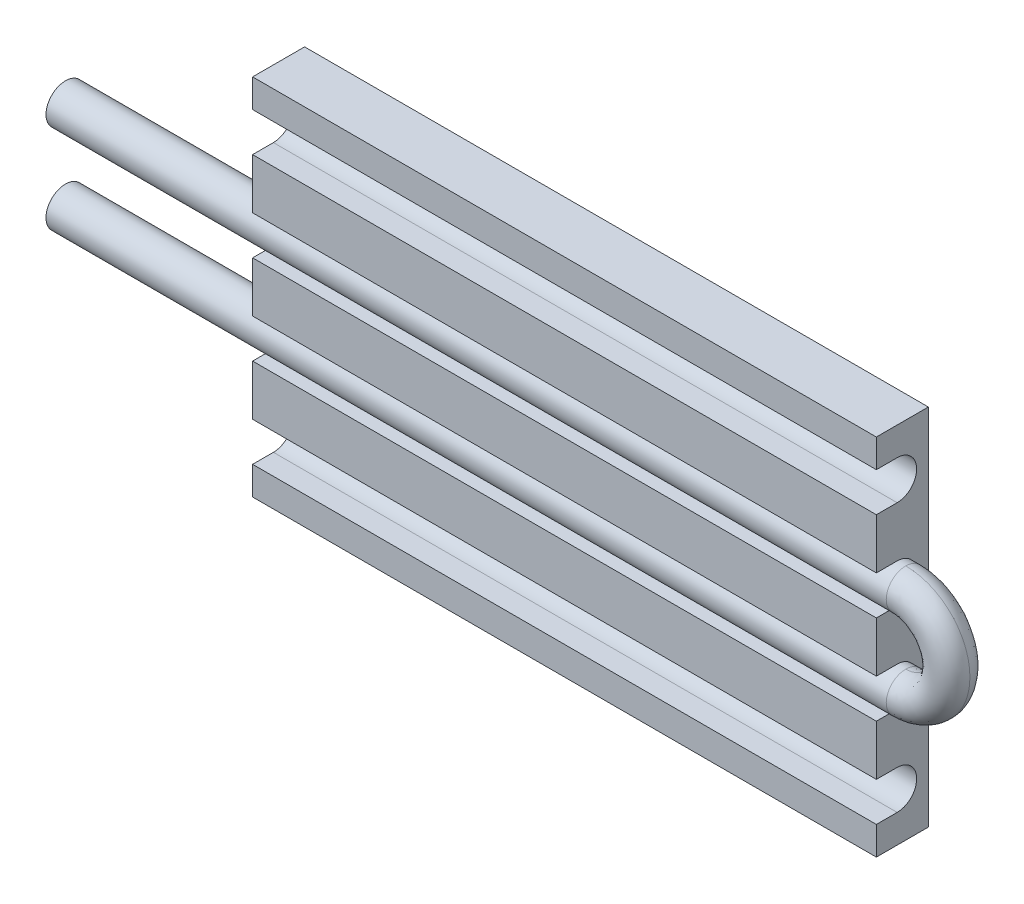
ISO-10303-21;
HEADER;
FILE_DESCRIPTION(('STEP AP214'),'2;1');
FILE_NAME('part.step','',(''),(''),'','','');
FILE_SCHEMA(('AUTOMOTIVE_DESIGN { 1 0 10303 214 1 1 1 1 }'));
ENDSEC;
DATA;
#1=APPLICATION_CONTEXT('core data for automotive mechanical design processes');
#2=APPLICATION_PROTOCOL_DEFINITION('international standard','automotive_design',2000,#1);
#3=PRODUCT_CONTEXT('',#1,'mechanical');
#4=PRODUCT('Part','Part','',(#3));
#5=PRODUCT_RELATED_PRODUCT_CATEGORY('part','',(#4));
#6=PRODUCT_DEFINITION_FORMATION('','',#4);
#7=PRODUCT_DEFINITION_CONTEXT('part definition',#1,'design');
#8=PRODUCT_DEFINITION('design','',#6,#7);
#9=PRODUCT_DEFINITION_SHAPE('','',#8);
#10=(LENGTH_UNIT() NAMED_UNIT(*) SI_UNIT(.MILLI.,.METRE.));
#11=(NAMED_UNIT(*) PLANE_ANGLE_UNIT() SI_UNIT($,.RADIAN.));
#12=(NAMED_UNIT(*) SI_UNIT($,.STERADIAN.) SOLID_ANGLE_UNIT());
#13=UNCERTAINTY_MEASURE_WITH_UNIT(LENGTH_MEASURE(1.E-05),#10,'distance_accuracy_value','');
#14=(GEOMETRIC_REPRESENTATION_CONTEXT(3) GLOBAL_UNCERTAINTY_ASSIGNED_CONTEXT((#13)) GLOBAL_UNIT_ASSIGNED_CONTEXT((#10,
#11,#12)) REPRESENTATION_CONTEXT('',''));
#15=CARTESIAN_POINT('',(0.,0.,0.));
#16=DIRECTION('',(0.,0.,1.));
#17=DIRECTION('',(1.,0.,0.));
#18=AXIS2_PLACEMENT_3D('',#15,#16,#17);
#19=CARTESIAN_POINT('',(94.8054999994022,-7.45329266260001,17.3045433430025));
#20=CARTESIAN_POINT('',(107.172085324602,-7.45329266260001,17.3045433430025));
#21=CARTESIAN_POINT('',(107.172085324602,4.91329266259999,17.3045433430025));
#22=CARTESIAN_POINT('',(94.8054999994022,4.91329266259999,17.3045433430025));
#23=CARTESIAN_POINT('',(94.8054999994021,-7.15216816960002,20.3057440716025));
#24=CARTESIAN_POINT('',(106.569836338602,-7.15216816960002,20.3057440716025));
#25=CARTESIAN_POINT('',(106.569836338602,4.61216816959998,20.3057440716025));
#26=CARTESIAN_POINT('',(94.8054999994021,4.61216816959998,20.3057440716025));
#27=CARTESIAN_POINT('',(94.8054999994021,-9.17573051820003,22.5424999994025));
#28=CARTESIAN_POINT('',(110.616961010402,-9.17573051820003,22.5424999994025));
#29=CARTESIAN_POINT('',(110.616961010402,6.63573051819998,22.5424999994026));
#30=CARTESIAN_POINT('',(94.8054999994021,6.63573051819998,22.5424999994025));
#31=CARTESIAN_POINT('',(94.8054999994021,-12.192,22.5424999994024));
#32=CARTESIAN_POINT('',(116.649499999402,-12.192,22.5424999994025));
#33=CARTESIAN_POINT('',(116.649499999402,9.65199999999998,22.5424999994026));
#34=CARTESIAN_POINT('',(94.8054999994021,9.65199999999998,22.5424999994025));
#35=CARTESIAN_POINT('',(94.8054999994021,-15.2082694818,22.5424999994024));
#36=CARTESIAN_POINT('',(122.682038988402,-15.2082694818,22.5424999994025));
#37=CARTESIAN_POINT('',(122.682038988402,12.6682694818,22.5424999994026));
#38=CARTESIAN_POINT('',(94.8054999994021,12.6682694818,22.5424999994025));
#39=CARTESIAN_POINT('',(94.8054999994021,-17.2318318304,20.3057440716024));
#40=CARTESIAN_POINT('',(126.729163660202,-17.2318318304,20.3057440716025));
#41=CARTESIAN_POINT('',(126.729163660202,14.6918318304,20.3057440716027));
#42=CARTESIAN_POINT('',(94.8054999994021,14.6918318304,20.3057440716025));
#43=CARTESIAN_POINT('',(94.8054999994022,-16.9307073374,17.3045433430024));
#44=CARTESIAN_POINT('',(126.126914674202,-16.9307073374,17.3045433430025));
#45=CARTESIAN_POINT('',(126.126914674202,14.3907073374,17.3045433430026));
#46=CARTESIAN_POINT('',(94.8054999994022,14.3907073374,17.3045433430025));
#47=(BOUNDED_SURFACE() B_SPLINE_SURFACE(3,3,((#19,#20,#21,#22),(#23,#24,#25,#26),(#27,#28,#29,
#30),(#31,#32,#33,#34),(#35,#36,#37,#38),(#39,#40,#41,#42),(#43,#44,#45,#46)),.UNSPECIFIED.,.F.,
.F.,.F.) B_SPLINE_SURFACE_WITH_KNOTS((4,3,4),(4,4),(0.,0.5,1.),(0.,1.),
.UNSPECIFIED.) GEOMETRIC_REPRESENTATION_ITEM() RATIONAL_B_SPLINE_SURFACE(((1.,0.333333333333333,
0.333333333333333,1.),(0.780588314885163,0.260196104961721,0.260196104961721,0.780588314885163),
(0.780588314885163,0.260196104961721,0.260196104961721,0.780588314885163),(1.,0.333333333333333,
0.333333333333333,1.),(0.780588314885163,0.260196104961721,0.260196104961721,0.780588314885163),
(0.780588314885163,0.260196104961721,0.260196104961721,0.780588314885163),(1.,0.333333333333333,
0.333333333333333,1.))) REPRESENTATION_ITEM('') SURFACE());
#48=CARTESIAN_POINT('',(94.8054999994022,-12.192,17.7799999994024));
#49=DIRECTION('',(-1.,0.,0.));
#50=DIRECTION('',(0.,-1.,0.));
#51=AXIS2_PLACEMENT_3D('',#48,#49,#50);
#52=CIRCLE('',#51,4.7625);
#53=CARTESIAN_POINT('',(94.8054999994022,-16.9545000003665,17.7799999986294));
#54=VERTEX_POINT('',#53);
#55=CARTESIAN_POINT('',(94.8054999994022,-7.42949999981678,17.7799999976526));
#56=VERTEX_POINT('',#55);
#57=EDGE_CURVE('E201',#54,#56,#52,.T.);
#58=CARTESIAN_POINT('',(94.8054999994022,-1.27000000000001,17.7799999978564));
#59=DIRECTION('',(0.,0.,-1.));
#60=DIRECTION('',(1.,0.,0.));
#61=AXIS2_PLACEMENT_3D('',#58,#59,#60);
#62=CIRCLE('',#61,15.6845000007329);
#63=CARTESIAN_POINT('',(94.8054999994022,14.4145000001832,17.7799999976527));
#64=VERTEX_POINT('',#63);
#65=EDGE_CURVE('E191',#64,#54,#62,.T.);
#66=CARTESIAN_POINT('',(94.8054999994021,9.65199999999999,17.7799999994025));
#67=DIRECTION('',(-1.,0.,0.));
#68=DIRECTION('',(0.,-1.,0.));
#69=AXIS2_PLACEMENT_3D('',#66,#67,#68);
#70=CIRCLE('',#69,4.7625);
#71=CARTESIAN_POINT('',(94.8054999994022,4.88949999963353,17.7799999986294));
#72=VERTEX_POINT('',#71);
#73=EDGE_CURVE('E209',#72,#64,#70,.T.);
#74=CARTESIAN_POINT('',(94.8054999994021,-1.27000000000001,17.7799999978564));
#75=DIRECTION('',(0.,0.,1.));
#76=DIRECTION('',(-1.,0.,0.));
#77=AXIS2_PLACEMENT_3D('',#74,#75,#76);
#78=CIRCLE('',#77,6.15949999926707);
#79=EDGE_CURVE('E202',#56,#72,#78,.T.);
#80=ORIENTED_EDGE('',*,*,#57,.F.);
#81=ORIENTED_EDGE('',*,*,#65,.F.);
#82=ORIENTED_EDGE('',*,*,#73,.F.);
#83=ORIENTED_EDGE('',*,*,#79,.F.);
#84=EDGE_LOOP('',(#80,#81,#82,#83));
#85=FACE_BOUND('',#84,.T.);
#86=ADVANCED_FACE('F42',(#85),#47,.T.);
#87=CARTESIAN_POINT('',(94.8054999994022,-16.9307073374,18.2554566558024));
#88=CARTESIAN_POINT('',(126.126914674202,-16.9307073374,18.2554566558025));
#89=CARTESIAN_POINT('',(126.126914674202,14.3907073374,18.2554566558026));
#90=CARTESIAN_POINT('',(94.8054999994022,14.3907073374,18.2554566558025));
#91=CARTESIAN_POINT('',(94.8054999994022,-17.2318318304,15.2542559272024));
#92=CARTESIAN_POINT('',(126.729163660202,-17.2318318304,15.2542559272025));
#93=CARTESIAN_POINT('',(126.729163660202,14.6918318304,15.2542559272027));
#94=CARTESIAN_POINT('',(94.8054999994022,14.6918318304,15.2542559272025));
#95=CARTESIAN_POINT('',(94.8054999994022,-15.2082694818,13.0174999994024));
#96=CARTESIAN_POINT('',(122.682038988402,-15.2082694818,13.0174999994025));
#97=CARTESIAN_POINT('',(122.682038988402,12.6682694818,13.0174999994026));
#98=CARTESIAN_POINT('',(94.8054999994022,12.6682694818,13.0174999994025));
#99=CARTESIAN_POINT('',(94.8054999994022,-12.192,13.0174999994024));
#100=CARTESIAN_POINT('',(116.649499999402,-12.192,13.0174999994025));
#101=CARTESIAN_POINT('',(116.649499999402,9.65200000000001,13.0174999994026));
#102=CARTESIAN_POINT('',(94.8054999994022,9.65200000000001,13.0174999994025));
#103=CARTESIAN_POINT('',(94.8054999994022,-9.17573051819999,13.0174999994025));
#104=CARTESIAN_POINT('',(110.616961010402,-9.17573051819999,13.0174999994025));
#105=CARTESIAN_POINT('',(110.616961010402,6.63573051820001,13.0174999994026));
#106=CARTESIAN_POINT('',(94.8054999994022,6.63573051820001,13.0174999994025));
#107=CARTESIAN_POINT('',(94.8054999994022,-7.1521681696,15.2542559272025));
#108=CARTESIAN_POINT('',(106.569836338602,-7.1521681696,15.2542559272025));
#109=CARTESIAN_POINT('',(106.569836338602,4.6121681696,15.2542559272025));
#110=CARTESIAN_POINT('',(94.8054999994022,4.6121681696,15.2542559272025));
#111=CARTESIAN_POINT('',(94.8054999994022,-7.45329266260001,18.2554566558025));
#112=CARTESIAN_POINT('',(107.172085324602,-7.45329266260001,18.2554566558025));
#113=CARTESIAN_POINT('',(107.172085324602,4.91329266259999,18.2554566558025));
#114=CARTESIAN_POINT('',(94.8054999994022,4.91329266259999,18.2554566558025));
#115=(BOUNDED_SURFACE() B_SPLINE_SURFACE(3,3,((#87,#88,#89,#90),(#91,#92,#93,#94),(#95,#96,#97,
#98),(#99,#100,#101,#102),(#103,#104,#105,#106),(#107,#108,#109,#110),(#111,#112,#113,#114)),
.UNSPECIFIED.,.F.,.F.,.F.) B_SPLINE_SURFACE_WITH_KNOTS((4,3,4),(4,4),(0.,0.5,1.),(0.,1.),
.UNSPECIFIED.) GEOMETRIC_REPRESENTATION_ITEM() RATIONAL_B_SPLINE_SURFACE(((1.,0.333333333333333,
0.333333333333333,1.),(0.780588314885163,0.260196104961721,0.260196104961721,0.780588314885163),
(0.780588314885163,0.260196104961721,0.260196104961721,0.780588314885163),(1.,0.333333333333333,
0.333333333333333,1.),(0.780588314885163,0.260196104961721,0.260196104961721,0.780588314885163),
(0.780588314885163,0.260196104961721,0.260196104961721,0.780588314885163),(1.,0.333333333333333,
0.333333333333333,1.))) REPRESENTATION_ITEM('') SURFACE());
#116=CARTESIAN_POINT('',(94.8054999994022,-12.192,17.7799999994024));
#117=DIRECTION('',(-1.,0.,0.));
#118=DIRECTION('',(0.,-1.,0.));
#119=AXIS2_PLACEMENT_3D('',#116,#117,#118);
#120=CIRCLE('',#119,4.7625);
#121=EDGE_CURVE('E194',#56,#54,#120,.T.);
#122=CARTESIAN_POINT('',(94.8054999994022,9.65199999999999,17.7799999994025));
#123=DIRECTION('',(-1.,0.,0.));
#124=DIRECTION('',(0.,-1.,0.));
#125=AXIS2_PLACEMENT_3D('',#122,#123,#124);
#126=CIRCLE('',#125,4.7625);
#127=EDGE_CURVE('E196',#64,#72,#126,.T.);
#128=ORIENTED_EDGE('',*,*,#65,.T.);
#129=ORIENTED_EDGE('',*,*,#121,.F.);
#130=ORIENTED_EDGE('',*,*,#79,.T.);
#131=ORIENTED_EDGE('',*,*,#127,.F.);
#132=EDGE_LOOP('',(#128,#129,#130,#131));
#133=FACE_BOUND('',#132,.T.);
#134=ADVANCED_FACE('F193',(#133),#115,.T.);
#135=CARTESIAN_POINT('',(-110.490000000598,-7.37234999999999,12.9603499994017));
#136=DIRECTION('',(-1.,0.,0.));
#137=DIRECTION('',(0.,-1.,0.));
#138=AXIS2_PLACEMENT_3D('',#135,#136,#137);
#139=PLANE('',#138);
#140=CARTESIAN_POINT('',(-110.490000000598,-12.192,17.7799999994017));
#141=DIRECTION('',(-1.,0.,0.));
#142=DIRECTION('',(0.,-1.,0.));
#143=AXIS2_PLACEMENT_3D('',#140,#141,#142);
#144=CIRCLE('',#143,4.7625);
#145=CARTESIAN_POINT('',(-110.490000000598,-16.9545,17.7799999994017));
#146=VERTEX_POINT('',#145);
#147=EDGE_CURVE('E47',#146,#146,#144,.F.);
#148=ORIENTED_EDGE('',*,*,#147,.F.);
#149=EDGE_LOOP('',(#148));
#150=FACE_BOUND('',#149,.T.);
#151=ADVANCED_FACE('F683',(#150),#139,.T.);
#152=CARTESIAN_POINT('',(-110.490000000598,4.83235000000001,12.9603499994018));
#153=DIRECTION('',(1.,0.,0.));
#154=DIRECTION('',(0.,1.,0.));
#155=AXIS2_PLACEMENT_3D('',#152,#153,#154);
#156=PLANE('',#155);
#157=CARTESIAN_POINT('',(-110.490000000598,9.65199999999999,17.7799999994018));
#158=DIRECTION('',(-1.,0.,0.));
#159=DIRECTION('',(0.,-1.,0.));
#160=AXIS2_PLACEMENT_3D('',#157,#158,#159);
#161=CIRCLE('',#160,4.7625);
#162=CARTESIAN_POINT('',(-110.490000000598,4.88949999999999,17.7799999994018));
#163=VERTEX_POINT('',#162);
#164=EDGE_CURVE('E263',#163,#163,#161,.F.);
#165=ORIENTED_EDGE('',*,*,#164,.F.);
#166=EDGE_LOOP('',(#165));
#167=FACE_BOUND('',#166,.T.);
#168=ADVANCED_FACE('F525',(#167),#156,.F.);
#169=CARTESIAN_POINT('',(-59.6900000005979,26.7335,17.779999999402));
#170=DIRECTION('',(0.,-1.,0.));
#171=DIRECTION('',(1.,0.,0.));
#172=AXIS2_PLACEMENT_3D('',#169,#170,#171);
#173=PLANE('',#172);
#174=DIRECTION('',(1.,0.,0.));
#175=VECTOR('',#174,1.);
#176=CARTESIAN_POINT('',(-59.6900000005979,26.7335,22.859999999402));
#177=LINE('',#176,#175);
#178=CARTESIAN_POINT('',(-59.6900000005979,26.7335,22.859999999402));
#179=VERTEX_POINT('',#178);
#180=CARTESIAN_POINT('',(92.7099999994021,26.7335,22.8599999994026));
#181=VERTEX_POINT('',#180);
#182=EDGE_CURVE('E273',#179,#181,#177,.T.);
#183=ORIENTED_EDGE('',*,*,#182,.T.);
#184=DIRECTION('',(0.,0.,1.));
#185=VECTOR('',#184,1.);
#186=CARTESIAN_POINT('',(92.7099999994022,26.7335,10.1599999994026));
#187=LINE('',#186,#185);
#188=CARTESIAN_POINT('',(92.7099999994022,26.7335,17.7799999991584));
#189=VERTEX_POINT('',#188);
#190=EDGE_CURVE('E245',#181,#189,#187,.F.);
#191=ORIENTED_EDGE('',*,*,#190,.T.);
#192=DIRECTION('',(1.,0.,0.));
#193=VECTOR('',#192,1.);
#194=CARTESIAN_POINT('',(-59.6900000005978,26.7335,17.7799999989136));
#195=LINE('',#194,#193);
#196=CARTESIAN_POINT('',(-59.6900000005979,26.7335,17.7799999991578));
#197=VERTEX_POINT('',#196);
#198=EDGE_CURVE('E347',#189,#197,#195,.F.);
#199=ORIENTED_EDGE('',*,*,#198,.T.);
#200=DIRECTION('',(0.,0.,1.));
#201=VECTOR('',#200,1.);
#202=CARTESIAN_POINT('',(-59.6900000005978,26.7335,10.159999999402));
#203=LINE('',#202,#201);
#204=EDGE_CURVE('E239',#179,#197,#203,.F.);
#205=ORIENTED_EDGE('',*,*,#204,.F.);
#206=EDGE_LOOP('',(#183,#191,#199,#205));
#207=FACE_BOUND('',#206,.T.);
#208=ADVANCED_FACE('F515',(#207),#173,.F.);
#209=CARTESIAN_POINT('',(-59.6900000005979,31.496,17.7799999994021));
#210=DIRECTION('',(1.,0.,0.));
#211=DIRECTION('',(0.,1.,0.));
#212=AXIS2_PLACEMENT_3D('',#209,#210,#211);
#213=CYLINDRICAL_SURFACE('',#212,4.7625);
#214=DIRECTION('',(-1.,0.,0.));
#215=VECTOR('',#214,1.);
#216=CARTESIAN_POINT('',(92.7099999994022,36.2585,17.7799999994026));
#217=LINE('',#216,#215);
#218=CARTESIAN_POINT('',(92.7099999994022,36.258499996825,17.7799999994026));
#219=VERTEX_POINT('',#218);
#220=CARTESIAN_POINT('',(-59.6900000005979,36.258499996825,17.7799999994021));
#221=VERTEX_POINT('',#220);
#222=EDGE_CURVE('E343',#219,#221,#217,.T.);
#223=ORIENTED_EDGE('',*,*,#222,.T.);
#224=CARTESIAN_POINT('',(-59.6900000005979,31.496,17.7799999994021));
#225=DIRECTION('',(1.,0.,0.));
#226=DIRECTION('',(0.,1.,0.));
#227=AXIS2_PLACEMENT_3D('',#224,#225,#226);
#228=CIRCLE('',#227,4.7625);
#229=EDGE_CURVE('E235',#197,#221,#228,.T.);
#230=ORIENTED_EDGE('',*,*,#229,.F.);
#231=ORIENTED_EDGE('',*,*,#198,.F.);
#232=CARTESIAN_POINT('',(92.7099999994022,31.4960000000002,17.7799999994026));
#233=DIRECTION('',(1.,0.,0.));
#234=DIRECTION('',(0.,1.,0.));
#235=AXIS2_PLACEMENT_3D('',#232,#233,#234);
#236=CIRCLE('',#235,4.7625);
#237=EDGE_CURVE('E240',#189,#219,#236,.T.);
#238=ORIENTED_EDGE('',*,*,#237,.T.);
#239=EDGE_LOOP('',(#223,#230,#231,#238));
#240=FACE_BOUND('',#239,.T.);
#241=ADVANCED_FACE('F517',(#240),#213,.F.);
#242=CARTESIAN_POINT('',(92.7099999994022,36.2585,17.7799999994026));
#243=DIRECTION('',(0.,1.,0.));
#244=DIRECTION('',(-1.,0.,0.));
#245=AXIS2_PLACEMENT_3D('',#242,#243,#244);
#246=PLANE('',#245);
#247=ORIENTED_EDGE('',*,*,#222,.F.);
#248=DIRECTION('',(0.,0.,1.));
#249=VECTOR('',#248,1.);
#250=CARTESIAN_POINT('',(92.7099999994022,36.25849999365,10.1599999994026));
#251=LINE('',#250,#249);
#252=CARTESIAN_POINT('',(92.7099999994021,36.2584999940028,22.8599999994026));
#253=VERTEX_POINT('',#252);
#254=EDGE_CURVE('E244',#219,#253,#251,.T.);
#255=ORIENTED_EDGE('',*,*,#254,.T.);
#256=DIRECTION('',(1.,0.,0.));
#257=VECTOR('',#256,1.);
#258=CARTESIAN_POINT('',(-59.6900000005979,36.2584999915333,22.8599999994021));
#259=LINE('',#258,#257);
#260=CARTESIAN_POINT('',(-59.6900000005979,36.2584999929444,22.8599999994021));
#261=VERTEX_POINT('',#260);
#262=EDGE_CURVE('E324',#253,#261,#259,.F.);
#263=ORIENTED_EDGE('',*,*,#262,.T.);
#264=DIRECTION('',(0.,0.,1.));
#265=VECTOR('',#264,1.);
#266=CARTESIAN_POINT('',(-59.6900000005978,36.25849999365,10.1599999994021));
#267=LINE('',#266,#265);
#268=EDGE_CURVE('E238',#221,#261,#267,.T.);
#269=ORIENTED_EDGE('',*,*,#268,.F.);
#270=EDGE_LOOP('',(#247,#255,#263,#269));
#271=FACE_BOUND('',#270,.T.);
#272=ADVANCED_FACE('F452',(#271),#246,.F.);
#273=CARTESIAN_POINT('',(-59.6900000005979,43.18,22.8599999994021));
#274=DIRECTION('',(0.,0.,-1.));
#275=DIRECTION('',(1.,0.,0.));
#276=AXIS2_PLACEMENT_3D('',#273,#274,#275);
#277=PLANE('',#276);
#278=ORIENTED_EDGE('',*,*,#262,.F.);
#279=DIRECTION('',(0.,-1.,0.));
#280=VECTOR('',#279,1.);
#281=CARTESIAN_POINT('',(92.7099999994021,43.18,22.8599999994026));
#282=LINE('',#281,#280);
#283=CARTESIAN_POINT('',(92.7099999994021,43.18,22.8599999994026));
#284=VERTEX_POINT('',#283);
#285=EDGE_CURVE('E335',#253,#284,#282,.F.);
#286=ORIENTED_EDGE('',*,*,#285,.T.);
#287=DIRECTION('',(1.,0.,0.));
#288=VECTOR('',#287,1.);
#289=CARTESIAN_POINT('',(-59.6900000005979,43.18,22.8599999994021));
#290=LINE('',#289,#288);
#291=CARTESIAN_POINT('',(-59.6900000005979,43.18,22.8599999994021));
#292=VERTEX_POINT('',#291);
#293=EDGE_CURVE('E385',#284,#292,#290,.F.);
#294=ORIENTED_EDGE('',*,*,#293,.T.);
#295=DIRECTION('',(0.,-1.,0.));
#296=VECTOR('',#295,1.);
#297=CARTESIAN_POINT('',(-59.6900000005979,43.18,22.8599999994021));
#298=LINE('',#297,#296);
#299=EDGE_CURVE('E351',#261,#292,#298,.F.);
#300=ORIENTED_EDGE('',*,*,#299,.F.);
#301=EDGE_LOOP('',(#278,#286,#294,#300));
#302=FACE_BOUND('',#301,.T.);
#303=ADVANCED_FACE('F454',(#302),#277,.F.);
#304=CARTESIAN_POINT('',(92.7099999994021,-38.7985,22.8599999994023));
#305=DIRECTION('',(0.,0.,-1.));
#306=DIRECTION('',(1.,0.,0.));
#307=AXIS2_PLACEMENT_3D('',#304,#305,#306);
#308=PLANE('',#307);
#309=DIRECTION('',(-1.,0.,0.));
#310=VECTOR('',#309,1.);
#311=CARTESIAN_POINT('',(92.7099999994021,-45.72,22.8599999994023));
#312=LINE('',#311,#310);
#313=CARTESIAN_POINT('',(-59.6900000005979,-45.72,22.8599999994018));
#314=VERTEX_POINT('',#313);
#315=CARTESIAN_POINT('',(92.7099999994021,-45.72,22.8599999994023));
#316=VERTEX_POINT('',#315);
#317=EDGE_CURVE('E332',#314,#316,#312,.F.);
#318=ORIENTED_EDGE('',*,*,#317,.T.);
#319=DIRECTION('',(0.,-1.,0.));
#320=VECTOR('',#319,1.);
#321=CARTESIAN_POINT('',(92.7099999994021,43.18,22.8599999994026));
#322=LINE('',#321,#320);
#323=CARTESIAN_POINT('',(92.7099999994021,-38.7984999957667,22.8599999994023));
#324=VERTEX_POINT('',#323);
#325=EDGE_CURVE('E375',#316,#324,#322,.F.);
#326=ORIENTED_EDGE('',*,*,#325,.T.);
#327=DIRECTION('',(1.,0.,0.));
#328=VECTOR('',#327,1.);
#329=CARTESIAN_POINT('',(92.7099999994021,-38.7985,22.8599999994023));
#330=LINE('',#329,#328);
#331=CARTESIAN_POINT('',(-59.6900000005979,-38.7984999957667,22.8599999994018));
#332=VERTEX_POINT('',#331);
#333=EDGE_CURVE('E320',#324,#332,#330,.F.);
#334=ORIENTED_EDGE('',*,*,#333,.T.);
#335=DIRECTION('',(0.,-1.,0.));
#336=VECTOR('',#335,1.);
#337=CARTESIAN_POINT('',(-59.6900000005979,43.18,22.8599999994021));
#338=LINE('',#337,#336);
#339=EDGE_CURVE('E325',#314,#332,#338,.F.);
#340=ORIENTED_EDGE('',*,*,#339,.F.);
#341=EDGE_LOOP('',(#318,#326,#334,#340));
#342=FACE_BOUND('',#341,.T.);
#343=ADVANCED_FACE('F473',(#342),#308,.F.);
#344=CARTESIAN_POINT('',(92.7099999994022,-38.7985,17.7799999994023));
#345=DIRECTION('',(0.,-1.,0.));
#346=DIRECTION('',(1.,0.,0.));
#347=AXIS2_PLACEMENT_3D('',#344,#345,#346);
#348=PLANE('',#347);
#349=ORIENTED_EDGE('',*,*,#333,.F.);
#350=DIRECTION('',(0.,0.,1.));
#351=VECTOR('',#350,1.);
#352=CARTESIAN_POINT('',(92.7099999994022,-38.7984999915333,10.1599999994023));
#353=LINE('',#352,#351);
#354=CARTESIAN_POINT('',(92.7099999994021,-38.7984999957666,17.7799999991581));
#355=VERTEX_POINT('',#354);
#356=EDGE_CURVE('E262',#324,#355,#353,.F.);
#357=ORIENTED_EDGE('',*,*,#356,.T.);
#358=DIRECTION('',(1.,0.,0.));
#359=VECTOR('',#358,1.);
#360=CARTESIAN_POINT('',(-59.6900000005978,-38.7985,17.7799999989134));
#361=LINE('',#360,#359);
#362=CARTESIAN_POINT('',(-59.6900000005978,-38.798499996825,17.7799999991576));
#363=VERTEX_POINT('',#362);
#364=EDGE_CURVE('E316',#355,#363,#361,.F.);
#365=ORIENTED_EDGE('',*,*,#364,.T.);
#366=DIRECTION('',(0.,0.,1.));
#367=VECTOR('',#366,1.);
#368=CARTESIAN_POINT('',(-59.6900000005978,-38.79849999365,10.1599999994018));
#369=LINE('',#368,#367);
#370=EDGE_CURVE('E234',#332,#363,#369,.F.);
#371=ORIENTED_EDGE('',*,*,#370,.F.);
#372=EDGE_LOOP('',(#349,#357,#365,#371));
#373=FACE_BOUND('',#372,.T.);
#374=ADVANCED_FACE('F476',(#373),#348,.F.);
#375=CARTESIAN_POINT('',(-59.6900000005979,-34.036,17.7799999994018));
#376=DIRECTION('',(1.,0.,0.));
#377=DIRECTION('',(0.,1.,0.));
#378=AXIS2_PLACEMENT_3D('',#375,#376,#377);
#379=CYLINDRICAL_SURFACE('',#378,4.7625);
#380=DIRECTION('',(-1.,0.,0.));
#381=VECTOR('',#380,1.);
#382=CARTESIAN_POINT('',(92.7099999994022,-29.2735,17.7799999994024));
#383=LINE('',#382,#381);
#384=CARTESIAN_POINT('',(92.7099999994021,-29.2735,17.7799999994024));
#385=VERTEX_POINT('',#384);
#386=CARTESIAN_POINT('',(-59.6900000005978,-29.2735,17.7799999994018));
#387=VERTEX_POINT('',#386);
#388=EDGE_CURVE('E312',#385,#387,#383,.T.);
#389=ORIENTED_EDGE('',*,*,#388,.T.);
#390=CARTESIAN_POINT('',(-59.6900000005978,-34.036,17.7799999994018));
#391=DIRECTION('',(1.,0.,0.));
#392=DIRECTION('',(0.,1.,0.));
#393=AXIS2_PLACEMENT_3D('',#390,#391,#392);
#394=CIRCLE('',#393,4.7625);
#395=EDGE_CURVE('E230',#363,#387,#394,.T.);
#396=ORIENTED_EDGE('',*,*,#395,.F.);
#397=ORIENTED_EDGE('',*,*,#364,.F.);
#398=CARTESIAN_POINT('',(92.7099999994021,-34.0359999999998,17.7799999994024));
#399=DIRECTION('',(1.,0.,0.));
#400=DIRECTION('',(0.,1.,0.));
#401=AXIS2_PLACEMENT_3D('',#398,#399,#400);
#402=CIRCLE('',#401,4.7625);
#403=EDGE_CURVE('E258',#355,#385,#402,.T.);
#404=ORIENTED_EDGE('',*,*,#403,.T.);
#405=EDGE_LOOP('',(#389,#396,#397,#404));
#406=FACE_BOUND('',#405,.T.);
#407=ADVANCED_FACE('F480',(#406),#379,.F.);
#408=CARTESIAN_POINT('',(92.7099999994022,-29.2735,17.7799999994024));
#409=DIRECTION('',(0.,1.,0.));
#410=DIRECTION('',(-1.,0.,0.));
#411=AXIS2_PLACEMENT_3D('',#408,#409,#410);
#412=PLANE('',#411);
#413=ORIENTED_EDGE('',*,*,#388,.F.);
#414=DIRECTION('',(0.,0.,1.));
#415=VECTOR('',#414,1.);
#416=CARTESIAN_POINT('',(92.7099999994022,-29.2735,10.1599999994024));
#417=LINE('',#416,#415);
#418=CARTESIAN_POINT('',(92.7099999937577,-29.2735,22.8599999994024));
#419=VERTEX_POINT('',#418);
#420=EDGE_CURVE('E261',#385,#419,#417,.T.);
#421=ORIENTED_EDGE('',*,*,#420,.T.);
#422=DIRECTION('',(1.,0.,0.));
#423=VECTOR('',#422,1.);
#424=CARTESIAN_POINT('',(-59.6900000005979,-29.2735,22.8599999994018));
#425=LINE('',#424,#423);
#426=CARTESIAN_POINT('',(-59.6900000005979,-29.2735,22.8599999994018));
#427=VERTEX_POINT('',#426);
#428=EDGE_CURVE('E302',#419,#427,#425,.F.);
#429=ORIENTED_EDGE('',*,*,#428,.T.);
#430=DIRECTION('',(0.,0.,1.));
#431=VECTOR('',#430,1.);
#432=CARTESIAN_POINT('',(-59.6900000005978,-29.2735,10.1599999994018));
#433=LINE('',#432,#431);
#434=EDGE_CURVE('E233',#387,#427,#433,.T.);
#435=ORIENTED_EDGE('',*,*,#434,.F.);
#436=EDGE_LOOP('',(#413,#421,#429,#435));
#437=FACE_BOUND('',#436,.T.);
#438=ADVANCED_FACE('F484',(#437),#412,.F.);
#439=CARTESIAN_POINT('',(-59.6900000005979,-16.9545,22.8599999994019));
#440=DIRECTION('',(0.,0.,-1.));
#441=DIRECTION('',(1.,0.,0.));
#442=AXIS2_PLACEMENT_3D('',#439,#440,#441);
#443=PLANE('',#442);
#444=ORIENTED_EDGE('',*,*,#428,.F.);
#445=DIRECTION('',(0.,-1.,0.));
#446=VECTOR('',#445,1.);
#447=CARTESIAN_POINT('',(92.7099999994021,43.18,22.8599999994026));
#448=LINE('',#447,#446);
#449=CARTESIAN_POINT('',(92.7099999928087,-16.95449999365,22.8599999994024));
#450=VERTEX_POINT('',#449);
#451=EDGE_CURVE('E371',#419,#450,#448,.F.);
#452=ORIENTED_EDGE('',*,*,#451,.T.);
#453=DIRECTION('',(1.,0.,0.));
#454=VECTOR('',#453,1.);
#455=CARTESIAN_POINT('',(-59.6900000005979,-16.9545,22.8599999994019));
#456=LINE('',#455,#454);
#457=CARTESIAN_POINT('',(-59.6900000005979,-16.9545,22.8599999994019));
#458=VERTEX_POINT('',#457);
#459=EDGE_CURVE('E301',#450,#458,#456,.F.);
#460=ORIENTED_EDGE('',*,*,#459,.T.);
#461=DIRECTION('',(0.,-1.,0.));
#462=VECTOR('',#461,1.);
#463=CARTESIAN_POINT('',(-59.6900000005979,43.18,22.8599999994021));
#464=LINE('',#463,#462);
#465=EDGE_CURVE('E306',#427,#458,#464,.F.);
#466=ORIENTED_EDGE('',*,*,#465,.F.);
#467=EDGE_LOOP('',(#444,#452,#460,#466));
#468=FACE_BOUND('',#467,.T.);
#469=ADVANCED_FACE('F488',(#468),#443,.F.);
#470=CARTESIAN_POINT('',(-59.6900000005979,-16.9545,17.7799999994019));
#471=DIRECTION('',(0.,-1.,0.));
#472=DIRECTION('',(1.,0.,0.));
#473=AXIS2_PLACEMENT_3D('',#470,#471,#472);
#474=PLANE('',#473);
#475=ORIENTED_EDGE('',*,*,#459,.F.);
#476=DIRECTION('',(0.,0.,1.));
#477=VECTOR('',#476,1.);
#478=CARTESIAN_POINT('',(92.7099999994022,-16.9544999873,10.1599999994024));
#479=LINE('',#478,#477);
#480=CARTESIAN_POINT('',(92.709999989512,-16.954499996825,17.7799999994024));
#481=VERTEX_POINT('',#480);
#482=EDGE_CURVE('E257',#450,#481,#479,.F.);
#483=ORIENTED_EDGE('',*,*,#482,.T.);
#484=DIRECTION('',(1.,0.,0.));
#485=VECTOR('',#484,1.);
#486=CARTESIAN_POINT('',(-59.6900000005979,-16.9545,17.7799999994019));
#487=LINE('',#486,#485);
#488=CARTESIAN_POINT('',(-59.6899999767377,-16.9545,17.7799999994019));
#489=VERTEX_POINT('',#488);
#490=EDGE_CURVE('E297',#489,#481,#487,.T.);
#491=ORIENTED_EDGE('',*,*,#490,.F.);
#492=DIRECTION('',(0.,0.,1.));
#493=VECTOR('',#492,1.);
#494=CARTESIAN_POINT('',(-59.6900000005978,-16.9545,10.1599999994019));
#495=LINE('',#494,#493);
#496=EDGE_CURVE('E229',#458,#489,#495,.F.);
#497=ORIENTED_EDGE('',*,*,#496,.F.);
#498=EDGE_LOOP('',(#475,#483,#491,#497));
#499=FACE_BOUND('',#498,.T.);
#500=ADVANCED_FACE('F565',(#499),#474,.F.);
#501=CARTESIAN_POINT('',(94.8054999994022,-12.192,17.7799999994024));
#502=DIRECTION('',(-1.,0.,0.));
#503=DIRECTION('',(0.,-1.,0.));
#504=AXIS2_PLACEMENT_3D('',#501,#502,#503);
#505=CYLINDRICAL_SURFACE('',#504,4.7625);
#506=ORIENTED_EDGE('',*,*,#57,.T.);
#507=ORIENTED_EDGE('',*,*,#121,.T.);
#508=EDGE_LOOP('',(#506,#507));
#509=FACE_BOUND('',#508,.T.);
#510=DIRECTION('',(-1.,0.,0.));
#511=VECTOR('',#510,1.);
#512=CARTESIAN_POINT('',(92.7099999994022,-7.42950000000001,17.7799999974488));
#513=LINE('',#512,#511);
#514=CARTESIAN_POINT('',(92.709999989512,-7.42950000000001,17.7799999984257));
#515=VERTEX_POINT('',#514);
#516=CARTESIAN_POINT('',(-59.6899999767377,-7.42950000000001,17.7799999984251));
#517=VERTEX_POINT('',#516);
#518=EDGE_CURVE('E293',#515,#517,#513,.T.);
#519=ORIENTED_EDGE('',*,*,#518,.T.);
#520=CARTESIAN_POINT('',(-59.6899999528776,-12.192,17.7799999994019));
#521=DIRECTION('',(-1.,0.,0.));
#522=DIRECTION('',(0.,-1.,0.));
#523=AXIS2_PLACEMENT_3D('',#520,#521,#522);
#524=CIRCLE('',#523,4.7625);
#525=EDGE_CURVE('E225',#489,#517,#524,.F.);
#526=ORIENTED_EDGE('',*,*,#525,.F.);
#527=ORIENTED_EDGE('',*,*,#490,.T.);
#528=CARTESIAN_POINT('',(92.7099999796219,-12.192,17.7799999994024));
#529=DIRECTION('',(-1.,0.,0.));
#530=DIRECTION('',(0.,-1.,0.));
#531=AXIS2_PLACEMENT_3D('',#528,#529,#530);
#532=CIRCLE('',#531,4.7625);
#533=EDGE_CURVE('E252',#481,#515,#532,.F.);
#534=ORIENTED_EDGE('',*,*,#533,.T.);
#535=EDGE_LOOP('',(#519,#526,#527,#534));
#536=FACE_BOUND('',#535,.T.);
#537=ORIENTED_EDGE('',*,*,#147,.T.);
#538=EDGE_LOOP('',(#537));
#539=FACE_BOUND('',#538,.T.);
#540=ADVANCED_FACE('F205',(#509,#536,#539),#505,.T.);
#541=CARTESIAN_POINT('',(92.7099999994021,-7.42950000000003,22.8599999994025));
#542=DIRECTION('',(0.,1.,0.));
#543=DIRECTION('',(-1.,0.,0.));
#544=AXIS2_PLACEMENT_3D('',#541,#542,#543);
#545=PLANE('',#544);
#546=ORIENTED_EDGE('',*,*,#518,.F.);
#547=DIRECTION('',(0.,0.,1.));
#548=VECTOR('',#547,1.);
#549=CARTESIAN_POINT('',(92.7099999994022,-7.42949999999999,10.1599999994025));
#550=LINE('',#549,#548);
#551=CARTESIAN_POINT('',(92.7099999937577,-7.42949999717781,22.8599999994025));
#552=VERTEX_POINT('',#551);
#553=EDGE_CURVE('E256',#515,#552,#550,.T.);
#554=ORIENTED_EDGE('',*,*,#553,.T.);
#555=DIRECTION('',(1.,0.,0.));
#556=VECTOR('',#555,1.);
#557=CARTESIAN_POINT('',(-59.6900000005979,-7.42949999153336,22.8599999994019));
#558=LINE('',#557,#556);
#559=CARTESIAN_POINT('',(-59.6900000005979,-7.42949999717781,22.8599999994019));
#560=VERTEX_POINT('',#559);
#561=EDGE_CURVE('E283',#552,#560,#558,.F.);
#562=ORIENTED_EDGE('',*,*,#561,.T.);
#563=DIRECTION('',(0.,0.,1.));
#564=VECTOR('',#563,1.);
#565=CARTESIAN_POINT('',(-59.6900000005978,-7.42949999999999,10.1599999994019));
#566=LINE('',#565,#564);
#567=EDGE_CURVE('E228',#517,#560,#566,.T.);
#568=ORIENTED_EDGE('',*,*,#567,.F.);
#569=EDGE_LOOP('',(#546,#554,#562,#568));
#570=FACE_BOUND('',#569,.T.);
#571=ADVANCED_FACE('F497',(#570),#545,.F.);
#572=CARTESIAN_POINT('',(-59.6900000005979,4.88949999999997,22.859999999402));
#573=DIRECTION('',(0.,0.,-1.));
#574=DIRECTION('',(1.,0.,0.));
#575=AXIS2_PLACEMENT_3D('',#572,#573,#574);
#576=PLANE('',#575);
#577=ORIENTED_EDGE('',*,*,#561,.F.);
#578=DIRECTION('',(0.,-1.,0.));
#579=VECTOR('',#578,1.);
#580=CARTESIAN_POINT('',(92.7099999994021,43.18,22.8599999994026));
#581=LINE('',#580,#579);
#582=CARTESIAN_POINT('',(92.7099999928087,4.88949999576664,22.8599999994025));
#583=VERTEX_POINT('',#582);
#584=EDGE_CURVE('E368',#552,#583,#581,.F.);
#585=ORIENTED_EDGE('',*,*,#584,.T.);
#586=DIRECTION('',(1.,0.,0.));
#587=VECTOR('',#586,1.);
#588=CARTESIAN_POINT('',(-59.6900000005979,4.88949999999997,22.859999999402));
#589=LINE('',#588,#587);
#590=CARTESIAN_POINT('',(-59.6900000005979,4.88949999999997,22.859999999402));
#591=VERTEX_POINT('',#590);
#592=EDGE_CURVE('E267',#583,#591,#589,.F.);
#593=ORIENTED_EDGE('',*,*,#592,.T.);
#594=DIRECTION('',(0.,-1.,0.));
#595=VECTOR('',#594,1.);
#596=CARTESIAN_POINT('',(-59.6900000005979,43.18,22.8599999994021));
#597=LINE('',#596,#595);
#598=EDGE_CURVE('E287',#560,#591,#597,.F.);
#599=ORIENTED_EDGE('',*,*,#598,.F.);
#600=EDGE_LOOP('',(#577,#585,#593,#599));
#601=FACE_BOUND('',#600,.T.);
#602=ADVANCED_FACE('F499',(#601),#576,.F.);
#603=CARTESIAN_POINT('',(-59.6900000005979,4.88949999999999,17.779999999402));
#604=DIRECTION('',(0.,-1.,0.));
#605=DIRECTION('',(1.,0.,0.));
#606=AXIS2_PLACEMENT_3D('',#603,#604,#605);
#607=PLANE('',#606);
#608=ORIENTED_EDGE('',*,*,#592,.F.);
#609=DIRECTION('',(0.,0.,1.));
#610=VECTOR('',#609,1.);
#611=CARTESIAN_POINT('',(92.7099999994022,4.88949999153335,10.1599999994025));
#612=LINE('',#611,#610);
#613=CARTESIAN_POINT('',(92.709999989512,4.88949999364999,17.7799999994025));
#614=VERTEX_POINT('',#613);
#615=EDGE_CURVE('E251',#583,#614,#612,.F.);
#616=ORIENTED_EDGE('',*,*,#615,.T.);
#617=DIRECTION('',(1.,0.,0.));
#618=VECTOR('',#617,1.);
#619=CARTESIAN_POINT('',(-59.6900000005979,4.88949999999999,17.779999999402));
#620=LINE('',#619,#618);
#621=CARTESIAN_POINT('',(-59.6899999767377,4.88949999999999,17.779999999402));
#622=VERTEX_POINT('',#621);
#623=EDGE_CURVE('E276',#622,#614,#620,.T.);
#624=ORIENTED_EDGE('',*,*,#623,.F.);
#625=DIRECTION('',(0.,0.,1.));
#626=VECTOR('',#625,1.);
#627=CARTESIAN_POINT('',(-59.6900000005978,4.88950000000002,10.159999999402));
#628=LINE('',#627,#626);
#629=EDGE_CURVE('E224',#591,#622,#628,.F.);
#630=ORIENTED_EDGE('',*,*,#629,.F.);
#631=EDGE_LOOP('',(#608,#616,#624,#630));
#632=FACE_BOUND('',#631,.T.);
#633=ADVANCED_FACE('F505',(#632),#607,.F.);
#634=CARTESIAN_POINT('',(94.8054999994022,9.65199999999999,17.7799999994025));
#635=DIRECTION('',(-1.,0.,0.));
#636=DIRECTION('',(0.,-1.,0.));
#637=AXIS2_PLACEMENT_3D('',#634,#635,#636);
#638=CYLINDRICAL_SURFACE('',#637,4.7625);
#639=ORIENTED_EDGE('',*,*,#73,.T.);
#640=ORIENTED_EDGE('',*,*,#127,.T.);
#641=EDGE_LOOP('',(#639,#640));
#642=FACE_BOUND('',#641,.T.);
#643=DIRECTION('',(-1.,0.,0.));
#644=VECTOR('',#643,1.);
#645=CARTESIAN_POINT('',(92.7099999994022,14.4145,17.7799999974489));
#646=LINE('',#645,#644);
#647=CARTESIAN_POINT('',(92.709999989512,14.4145,17.7799999984257));
#648=VERTEX_POINT('',#647);
#649=CARTESIAN_POINT('',(-59.6899999767377,14.4145,17.7799999984252));
#650=VERTEX_POINT('',#649);
#651=EDGE_CURVE('E266',#648,#650,#646,.T.);
#652=ORIENTED_EDGE('',*,*,#651,.T.);
#653=CARTESIAN_POINT('',(-59.6899999528776,9.65199999999999,17.779999999402));
#654=DIRECTION('',(-1.,0.,0.));
#655=DIRECTION('',(0.,-1.,0.));
#656=AXIS2_PLACEMENT_3D('',#653,#654,#655);
#657=CIRCLE('',#656,4.7625);
#658=EDGE_CURVE('E220',#622,#650,#657,.F.);
#659=ORIENTED_EDGE('',*,*,#658,.F.);
#660=ORIENTED_EDGE('',*,*,#623,.T.);
#661=CARTESIAN_POINT('',(92.7099999796219,9.65199999999999,17.7799999994025));
#662=DIRECTION('',(-1.,0.,0.));
#663=DIRECTION('',(0.,-1.,0.));
#664=AXIS2_PLACEMENT_3D('',#661,#662,#663);
#665=CIRCLE('',#664,4.7625);
#666=EDGE_CURVE('E246',#614,#648,#665,.F.);
#667=ORIENTED_EDGE('',*,*,#666,.T.);
#668=EDGE_LOOP('',(#652,#659,#660,#667));
#669=FACE_BOUND('',#668,.T.);
#670=ORIENTED_EDGE('',*,*,#164,.T.);
#671=EDGE_LOOP('',(#670));
#672=FACE_BOUND('',#671,.T.);
#673=ADVANCED_FACE('F507',(#642,#669,#672),#638,.T.);
#674=CARTESIAN_POINT('',(92.7099999994022,14.4145,17.7799999994025));
#675=DIRECTION('',(0.,1.,0.));
#676=DIRECTION('',(-1.,0.,0.));
#677=AXIS2_PLACEMENT_3D('',#674,#675,#676);
#678=PLANE('',#677);
#679=ORIENTED_EDGE('',*,*,#651,.F.);
#680=DIRECTION('',(0.,0.,1.));
#681=VECTOR('',#680,1.);
#682=CARTESIAN_POINT('',(92.7099999994022,14.4145,10.1599999994025));
#683=LINE('',#682,#681);
#684=CARTESIAN_POINT('',(92.7099999994021,14.4145,22.8599999994025));
#685=VERTEX_POINT('',#684);
#686=EDGE_CURVE('E250',#648,#685,#683,.T.);
#687=ORIENTED_EDGE('',*,*,#686,.T.);
#688=DIRECTION('',(1.,0.,0.));
#689=VECTOR('',#688,1.);
#690=CARTESIAN_POINT('',(-59.6900000005979,14.4145,22.859999999402));
#691=LINE('',#690,#689);
#692=CARTESIAN_POINT('',(-59.6900000005979,14.4145,22.859999999402));
#693=VERTEX_POINT('',#692);
#694=EDGE_CURVE('E336',#685,#693,#691,.F.);
#695=ORIENTED_EDGE('',*,*,#694,.T.);
#696=DIRECTION('',(0.,0.,1.));
#697=VECTOR('',#696,1.);
#698=CARTESIAN_POINT('',(-59.6900000005978,14.4145,10.159999999402));
#699=LINE('',#698,#697);
#700=EDGE_CURVE('E223',#650,#693,#699,.T.);
#701=ORIENTED_EDGE('',*,*,#700,.F.);
#702=EDGE_LOOP('',(#679,#687,#695,#701));
#703=FACE_BOUND('',#702,.T.);
#704=ADVANCED_FACE('F509',(#703),#678,.F.);
#705=CARTESIAN_POINT('',(-59.6900000005979,26.7335,22.859999999402));
#706=DIRECTION('',(0.,0.,-1.));
#707=DIRECTION('',(1.,0.,0.));
#708=AXIS2_PLACEMENT_3D('',#705,#706,#707);
#709=PLANE('',#708);
#710=ORIENTED_EDGE('',*,*,#694,.F.);
#711=DIRECTION('',(0.,-1.,0.));
#712=VECTOR('',#711,1.);
#713=CARTESIAN_POINT('',(92.7099999994021,43.18,22.8599999994026));
#714=LINE('',#713,#712);
#715=EDGE_CURVE('E362',#685,#181,#714,.F.);
#716=ORIENTED_EDGE('',*,*,#715,.T.);
#717=ORIENTED_EDGE('',*,*,#182,.F.);
#718=DIRECTION('',(0.,-1.,0.));
#719=VECTOR('',#718,1.);
#720=CARTESIAN_POINT('',(-59.6900000005979,43.18,22.8599999994021));
#721=LINE('',#720,#719);
#722=EDGE_CURVE('E341',#693,#179,#721,.F.);
#723=ORIENTED_EDGE('',*,*,#722,.F.);
#724=EDGE_LOOP('',(#710,#716,#717,#723));
#725=FACE_BOUND('',#724,.T.);
#726=ADVANCED_FACE('F512',(#725),#709,.F.);
#727=CARTESIAN_POINT('',(92.7099999994022,-45.72,10.1599999994023));
#728=DIRECTION('',(0.,1.,0.));
#729=DIRECTION('',(-1.,0.,0.));
#730=AXIS2_PLACEMENT_3D('',#727,#728,#729);
#731=PLANE('',#730);
#732=DIRECTION('',(-1.,0.,0.));
#733=VECTOR('',#732,1.);
#734=CARTESIAN_POINT('',(92.7099999994022,-45.72,10.1599999994023));
#735=LINE('',#734,#733);
#736=CARTESIAN_POINT('',(-59.6900000005978,-45.72,10.1599999994018));
#737=VERTEX_POINT('',#736);
#738=CARTESIAN_POINT('',(92.7099999994022,-45.72,10.1599999994023));
#739=VERTEX_POINT('',#738);
#740=EDGE_CURVE('E337',#737,#739,#735,.F.);
#741=ORIENTED_EDGE('',*,*,#740,.T.);
#742=DIRECTION('',(0.,0.,1.));
#743=VECTOR('',#742,1.);
#744=CARTESIAN_POINT('',(92.7099999994022,-45.72,10.1599999994023));
#745=LINE('',#744,#743);
#746=EDGE_CURVE('E361',#739,#316,#745,.T.);
#747=ORIENTED_EDGE('',*,*,#746,.T.);
#748=ORIENTED_EDGE('',*,*,#317,.F.);
#749=DIRECTION('',(0.,0.,1.));
#750=VECTOR('',#749,1.);
#751=CARTESIAN_POINT('',(-59.6900000005978,-45.72,10.1599999994018));
#752=LINE('',#751,#750);
#753=EDGE_CURVE('E328',#737,#314,#752,.T.);
#754=ORIENTED_EDGE('',*,*,#753,.F.);
#755=EDGE_LOOP('',(#741,#747,#748,#754));
#756=FACE_BOUND('',#755,.T.);
#757=ADVANCED_FACE('F469',(#756),#731,.F.);
#758=CARTESIAN_POINT('',(92.7099999994022,43.18,10.1599999994026));
#759=DIRECTION('',(-1.,0.,0.));
#760=DIRECTION('',(0.,-1.,0.));
#761=AXIS2_PLACEMENT_3D('',#758,#759,#760);
#762=PLANE('',#761);
#763=ORIENTED_EDGE('',*,*,#237,.F.);
#764=ORIENTED_EDGE('',*,*,#190,.F.);
#765=ORIENTED_EDGE('',*,*,#715,.F.);
#766=ORIENTED_EDGE('',*,*,#686,.F.);
#767=ORIENTED_EDGE('',*,*,#666,.F.);
#768=ORIENTED_EDGE('',*,*,#615,.F.);
#769=ORIENTED_EDGE('',*,*,#584,.F.);
#770=ORIENTED_EDGE('',*,*,#553,.F.);
#771=ORIENTED_EDGE('',*,*,#533,.F.);
#772=ORIENTED_EDGE('',*,*,#482,.F.);
#773=ORIENTED_EDGE('',*,*,#451,.F.);
#774=ORIENTED_EDGE('',*,*,#420,.F.);
#775=ORIENTED_EDGE('',*,*,#403,.F.);
#776=ORIENTED_EDGE('',*,*,#356,.F.);
#777=ORIENTED_EDGE('',*,*,#325,.F.);
#778=ORIENTED_EDGE('',*,*,#746,.F.);
#779=DIRECTION('',(0.,-1.,0.));
#780=VECTOR('',#779,1.);
#781=CARTESIAN_POINT('',(92.7099999994022,43.18,10.1599999994026));
#782=LINE('',#781,#780);
#783=CARTESIAN_POINT('',(92.7099999994022,43.18,10.1599999994026));
#784=VERTEX_POINT('',#783);
#785=EDGE_CURVE('E340',#739,#784,#782,.F.);
#786=ORIENTED_EDGE('',*,*,#785,.T.);
#787=DIRECTION('',(0.,0.,1.));
#788=VECTOR('',#787,1.);
#789=CARTESIAN_POINT('',(92.7099999994022,43.18,10.1599999994026));
#790=LINE('',#789,#788);
#791=EDGE_CURVE('E388',#784,#284,#790,.T.);
#792=ORIENTED_EDGE('',*,*,#791,.T.);
#793=ORIENTED_EDGE('',*,*,#285,.F.);
#794=ORIENTED_EDGE('',*,*,#254,.F.);
#795=EDGE_LOOP('',(#763,#764,#765,#766,#767,#768,#769,#770,#771,#772,#773,#774,#775,#776,#777,
#778,#786,#792,#793,#794));
#796=FACE_BOUND('',#795,.T.);
#797=ADVANCED_FACE('F465',(#796),#762,.F.);
#798=CARTESIAN_POINT('',(-59.6900000005978,43.18,10.1599999994021));
#799=DIRECTION('',(0.,-1.,0.));
#800=DIRECTION('',(1.,0.,0.));
#801=AXIS2_PLACEMENT_3D('',#798,#799,#800);
#802=PLANE('',#801);
#803=ORIENTED_EDGE('',*,*,#293,.F.);
#804=ORIENTED_EDGE('',*,*,#791,.F.);
#805=DIRECTION('',(-1.,0.,0.));
#806=VECTOR('',#805,1.);
#807=CARTESIAN_POINT('',(92.7099999994022,43.18,10.1599999994026));
#808=LINE('',#807,#806);
#809=CARTESIAN_POINT('',(-59.6900000005978,43.18,10.1599999994021));
#810=VERTEX_POINT('',#809);
#811=EDGE_CURVE('E54',#784,#810,#808,.T.);
#812=ORIENTED_EDGE('',*,*,#811,.T.);
#813=DIRECTION('',(0.,0.,1.));
#814=VECTOR('',#813,1.);
#815=CARTESIAN_POINT('',(-59.6900000005978,43.18,10.1599999994021));
#816=LINE('',#815,#814);
#817=EDGE_CURVE('E62',#292,#810,#816,.F.);
#818=ORIENTED_EDGE('',*,*,#817,.F.);
#819=EDGE_LOOP('',(#803,#804,#812,#818));
#820=FACE_BOUND('',#819,.T.);
#821=ADVANCED_FACE('F458',(#820),#802,.F.);
#822=CARTESIAN_POINT('',(-59.6900000005978,43.18,10.1599999994021));
#823=DIRECTION('',(-1.,0.,0.));
#824=DIRECTION('',(0.,-1.,0.));
#825=AXIS2_PLACEMENT_3D('',#822,#823,#824);
#826=PLANE('',#825);
#827=ORIENTED_EDGE('',*,*,#700,.T.);
#828=ORIENTED_EDGE('',*,*,#722,.T.);
#829=ORIENTED_EDGE('',*,*,#204,.T.);
#830=ORIENTED_EDGE('',*,*,#229,.T.);
#831=ORIENTED_EDGE('',*,*,#268,.T.);
#832=ORIENTED_EDGE('',*,*,#299,.T.);
#833=ORIENTED_EDGE('',*,*,#817,.T.);
#834=DIRECTION('',(0.,-1.,0.));
#835=VECTOR('',#834,1.);
#836=CARTESIAN_POINT('',(-59.6900000005978,43.18,10.1599999994021));
#837=LINE('',#836,#835);
#838=EDGE_CURVE('E11',#810,#737,#837,.T.);
#839=ORIENTED_EDGE('',*,*,#838,.T.);
#840=ORIENTED_EDGE('',*,*,#753,.T.);
#841=ORIENTED_EDGE('',*,*,#339,.T.);
#842=ORIENTED_EDGE('',*,*,#370,.T.);
#843=ORIENTED_EDGE('',*,*,#395,.T.);
#844=ORIENTED_EDGE('',*,*,#434,.T.);
#845=ORIENTED_EDGE('',*,*,#465,.T.);
#846=ORIENTED_EDGE('',*,*,#496,.T.);
#847=ORIENTED_EDGE('',*,*,#525,.T.);
#848=ORIENTED_EDGE('',*,*,#567,.T.);
#849=ORIENTED_EDGE('',*,*,#598,.T.);
#850=ORIENTED_EDGE('',*,*,#629,.T.);
#851=ORIENTED_EDGE('',*,*,#658,.T.);
#852=EDGE_LOOP('',(#827,#828,#829,#830,#831,#832,#833,#839,#840,#841,#842,#843,#844,#845,#846,
#847,#848,#849,#850,#851));
#853=FACE_BOUND('',#852,.T.);
#854=ADVANCED_FACE('F449',(#853),#826,.T.);
#855=CARTESIAN_POINT('',(92.7099999994022,43.18,10.1599999994026));
#856=DIRECTION('',(0.,0.,1.));
#857=DIRECTION('',(-1.,0.,0.));
#858=AXIS2_PLACEMENT_3D('',#855,#856,#857);
#859=PLANE('',#858);
#860=CARTESIAN_POINT('',(54.6099999994022,-1.26999999999997,10.1599999994023));
#861=DIRECTION('',(0.,0.,-1.));
#862=DIRECTION('',(-1.,0.,0.));
#863=AXIS2_PLACEMENT_3D('',#860,#861,#862);
#864=CIRCLE('',#863,3.175);
#865=CARTESIAN_POINT('',(51.4349999994022,-1.26999999999997,10.1599999994023));
#866=VERTEX_POINT('',#865);
#867=EDGE_CURVE('E767',#866,#866,#864,.T.);
#868=ORIENTED_EDGE('',*,*,#867,.F.);
#869=EDGE_LOOP('',(#868));
#870=FACE_BOUND('',#869,.T.);
#871=ORIENTED_EDGE('',*,*,#811,.F.);
#872=ORIENTED_EDGE('',*,*,#785,.F.);
#873=ORIENTED_EDGE('',*,*,#740,.F.);
#874=ORIENTED_EDGE('',*,*,#838,.F.);
#875=EDGE_LOOP('',(#871,#872,#873,#874));
#876=FACE_BOUND('',#875,.T.);
#877=ADVANCED_FACE('F463',(#870,#876),#859,.F.);
#878=CARTESIAN_POINT('',(54.6099999994022,-1.26999999999998,12.6999999994023));
#879=DIRECTION('',(0.,0.,-1.));
#880=DIRECTION('',(-1.,0.,0.));
#881=AXIS2_PLACEMENT_3D('',#878,#879,#880);
#882=CYLINDRICAL_SURFACE('',#881,3.175);
#883=CARTESIAN_POINT('',(54.6099999994022,-1.26999999999998,12.6999999994023));
#884=DIRECTION('',(0.,0.,-1.));
#885=DIRECTION('',(-1.,0.,0.));
#886=AXIS2_PLACEMENT_3D('',#883,#884,#885);
#887=CIRCLE('',#886,3.175);
#888=CARTESIAN_POINT('',(51.4349999994022,-1.26999999999998,12.6999999994023));
#889=VERTEX_POINT('',#888);
#890=EDGE_CURVE('E218',#889,#889,#887,.T.);
#891=ORIENTED_EDGE('',*,*,#890,.F.);
#892=EDGE_LOOP('',(#891));
#893=FACE_BOUND('',#892,.T.);
#894=ORIENTED_EDGE('',*,*,#867,.T.);
#895=EDGE_LOOP('',(#894));
#896=FACE_BOUND('',#895,.T.);
#897=ADVANCED_FACE('F528',(#893,#896),#882,.F.);
#898=CARTESIAN_POINT('',(54.6099999994022,-1.26999999999998,12.6999999994023));
#899=DIRECTION('',(0.,0.,-1.));
#900=DIRECTION('',(-1.,0.,0.));
#901=AXIS2_PLACEMENT_3D('',#898,#899,#900);
#902=PLANE('',#901);
#903=ORIENTED_EDGE('',*,*,#890,.T.);
#904=EDGE_LOOP('',(#903));
#905=FACE_BOUND('',#904,.T.);
#906=ADVANCED_FACE('F536',(#905),#902,.T.);
#907=CLOSED_SHELL('',(#86,#134,#151,#168,#208,#241,#272,#303,#343,#374,#407,#438,#469,#500,#540,
#571,#602,#633,#673,#704,#726,#757,#797,#821,#854,#877,#897,#906));
#908=MANIFOLD_SOLID_BREP('B2',#907);
#909=ADVANCED_BREP_SHAPE_REPRESENTATION('',(#18,#908),#14);
#910=SHAPE_DEFINITION_REPRESENTATION(#9,#909);
ENDSEC;
END-ISO-10303-21;
